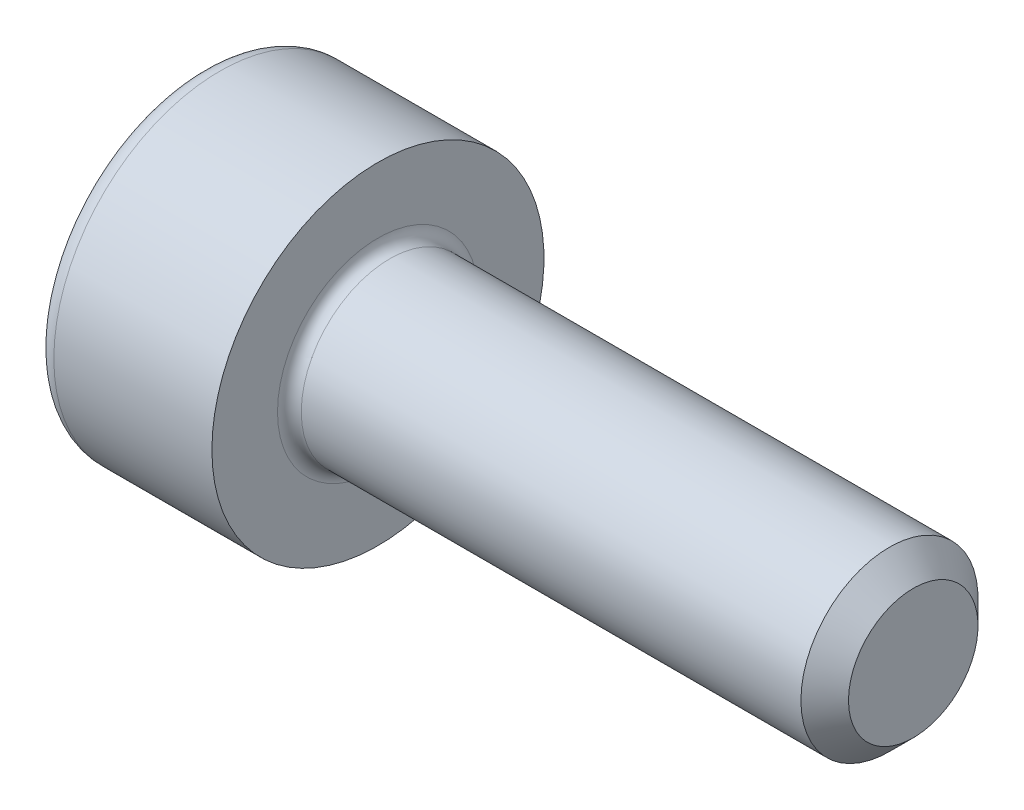
ISO-10303-21;
HEADER;
FILE_DESCRIPTION(('STEP AP214'),'2;1');
FILE_NAME('part.step','',(''),(''),'','','');
FILE_SCHEMA(('AUTOMOTIVE_DESIGN { 1 0 10303 214 1 1 1 1 }'));
ENDSEC;
DATA;
#1=APPLICATION_CONTEXT('core data for automotive mechanical design processes');
#2=APPLICATION_PROTOCOL_DEFINITION('international standard','automotive_design',2000,#1);
#3=PRODUCT_CONTEXT('',#1,'mechanical');
#4=PRODUCT('Part','Part','',(#3));
#5=PRODUCT_RELATED_PRODUCT_CATEGORY('part','',(#4));
#6=PRODUCT_DEFINITION_FORMATION('','',#4);
#7=PRODUCT_DEFINITION_CONTEXT('part definition',#1,'design');
#8=PRODUCT_DEFINITION('design','',#6,#7);
#9=PRODUCT_DEFINITION_SHAPE('','',#8);
#10=(LENGTH_UNIT() NAMED_UNIT(*) SI_UNIT(.MILLI.,.METRE.));
#11=(NAMED_UNIT(*) PLANE_ANGLE_UNIT() SI_UNIT($,.RADIAN.));
#12=(NAMED_UNIT(*) SI_UNIT($,.STERADIAN.) SOLID_ANGLE_UNIT());
#13=UNCERTAINTY_MEASURE_WITH_UNIT(LENGTH_MEASURE(1.E-05),#10,'distance_accuracy_value','');
#14=(GEOMETRIC_REPRESENTATION_CONTEXT(3) GLOBAL_UNCERTAINTY_ASSIGNED_CONTEXT((#13)) GLOBAL_UNIT_ASSIGNED_CONTEXT((#10,
#11,#12)) REPRESENTATION_CONTEXT('',''));
#15=CARTESIAN_POINT('',(0.,0.,0.));
#16=DIRECTION('',(0.,0.,1.));
#17=DIRECTION('',(1.,0.,0.));
#18=AXIS2_PLACEMENT_3D('',#15,#16,#17);
#19=CARTESIAN_POINT('',(0.,0.,0.));
#20=DIRECTION('',(-1.,0.,0.));
#21=DIRECTION('',(0.,0.,1.));
#22=AXIS2_PLACEMENT_3D('',#19,#20,#21);
#23=CYLINDRICAL_SURFACE('',#22,1.39568824458778);
#24=CARTESIAN_POINT('',(0.16,0.,0.));
#25=DIRECTION('',(1.,0.,0.));
#26=DIRECTION('',(0.,0.,-1.));
#27=AXIS2_PLACEMENT_3D('',#24,#25,#26);
#28=CIRCLE('',#27,1.39568824458778);
#29=CARTESIAN_POINT('',(0.16,0.,-1.39568824458778));
#30=VERTEX_POINT('',#29);
#31=EDGE_CURVE('E157',#30,#30,#28,.T.);
#32=ORIENTED_EDGE('',*,*,#31,.T.);
#33=EDGE_LOOP('',(#32));
#34=FACE_BOUND('',#33,.T.);
#35=CARTESIAN_POINT('',(1.48873412756029,0.,0.));
#36=DIRECTION('',(-1.,0.,0.));
#37=DIRECTION('',(0.,0.,1.));
#38=AXIS2_PLACEMENT_3D('',#35,#36,#37);
#39=CIRCLE('',#38,1.39568824458778);
#40=CARTESIAN_POINT('',(1.48873412756029,0.,1.39568824458778));
#41=VERTEX_POINT('',#40);
#42=EDGE_CURVE('E140',#41,#41,#39,.T.);
#43=ORIENTED_EDGE('',*,*,#42,.T.);
#44=EDGE_LOOP('',(#43));
#45=FACE_BOUND('',#44,.T.);
#46=ADVANCED_FACE('F38',(#34,#45),#23,.T.);
#47=CARTESIAN_POINT('',(0.,0.,0.));
#48=DIRECTION('',(1.,0.,0.));
#49=DIRECTION('',(0.,0.,-1.));
#50=AXIS2_PLACEMENT_3D('',#47,#48,#49);
#51=PLANE('',#50);
#52=DIRECTION('',(0.,-0.5,-0.866025403784439));
#53=VECTOR('',#52,1.);
#54=CARTESIAN_POINT('',(0.,0.877572409168232,0.));
#55=LINE('',#54,#53);
#56=CARTESIAN_POINT('',(0.,0.877572409168232,0.));
#57=VERTEX_POINT('',#56);
#58=CARTESIAN_POINT('',(0.,0.438786204584116,-0.760000000000001));
#59=VERTEX_POINT('',#58);
#60=EDGE_CURVE('E127',#57,#59,#55,.T.);
#61=ORIENTED_EDGE('',*,*,#60,.F.);
#62=DIRECTION('',(0.,0.5,-0.866025403784439));
#63=VECTOR('',#62,1.);
#64=CARTESIAN_POINT('',(0.,0.438786204584116,0.76));
#65=LINE('',#64,#63);
#66=CARTESIAN_POINT('',(0.,0.438786204584116,0.76));
#67=VERTEX_POINT('',#66);
#68=EDGE_CURVE('E53',#67,#57,#65,.T.);
#69=ORIENTED_EDGE('',*,*,#68,.F.);
#70=DIRECTION('',(0.,1.,0.));
#71=VECTOR('',#70,1.);
#72=CARTESIAN_POINT('',(0.,-0.438786204584116,0.76));
#73=LINE('',#72,#71);
#74=CARTESIAN_POINT('',(0.,-0.438786204584116,0.76));
#75=VERTEX_POINT('',#74);
#76=EDGE_CURVE('E136',#75,#67,#73,.T.);
#77=ORIENTED_EDGE('',*,*,#76,.F.);
#78=DIRECTION('',(0.,0.5,0.866025403784439));
#79=VECTOR('',#78,1.);
#80=CARTESIAN_POINT('',(0.,-0.877572409168232,0.));
#81=LINE('',#80,#79);
#82=CARTESIAN_POINT('',(0.,-0.877572409168232,0.));
#83=VERTEX_POINT('',#82);
#84=EDGE_CURVE('E134',#83,#75,#81,.T.);
#85=ORIENTED_EDGE('',*,*,#84,.F.);
#86=DIRECTION('',(0.,-0.5,0.866025403784438));
#87=VECTOR('',#86,1.);
#88=CARTESIAN_POINT('',(0.,-0.438786204584116,-0.760000000000001));
#89=LINE('',#88,#87);
#90=CARTESIAN_POINT('',(0.,-0.438786204584116,-0.760000000000001));
#91=VERTEX_POINT('',#90);
#92=EDGE_CURVE('E101',#91,#83,#89,.T.);
#93=ORIENTED_EDGE('',*,*,#92,.F.);
#94=DIRECTION('',(0.,-1.,0.));
#95=VECTOR('',#94,1.);
#96=CARTESIAN_POINT('',(0.,0.438786204584116,-0.760000000000001));
#97=LINE('',#96,#95);
#98=EDGE_CURVE('E130',#59,#91,#97,.T.);
#99=ORIENTED_EDGE('',*,*,#98,.F.);
#100=EDGE_LOOP('',(#61,#69,#77,#85,#93,#99));
#101=FACE_BOUND('',#100,.T.);
#102=CARTESIAN_POINT('',(0.,0.,0.));
#103=DIRECTION('',(1.,0.,0.));
#104=DIRECTION('',(0.,0.,-1.));
#105=AXIS2_PLACEMENT_3D('',#102,#103,#104);
#106=CIRCLE('',#105,1.23568824458778);
#107=CARTESIAN_POINT('',(0.,0.,-1.23568824458778));
#108=VERTEX_POINT('',#107);
#109=EDGE_CURVE('E154',#108,#108,#106,.F.);
#110=ORIENTED_EDGE('',*,*,#109,.T.);
#111=EDGE_LOOP('',(#110));
#112=FACE_BOUND('',#111,.T.);
#113=ADVANCED_FACE('F179',(#101,#112),#51,.F.);
#114=CARTESIAN_POINT('',(5.98873412756029,0.,0.));
#115=DIRECTION('',(-1.,0.,0.));
#116=DIRECTION('',(0.,0.,1.));
#117=AXIS2_PLACEMENT_3D('',#114,#115,#116);
#118=PLANE('',#117);
#119=CARTESIAN_POINT('',(5.98873412756029,0.,0.));
#120=DIRECTION('',(-1.,0.,0.));
#121=DIRECTION('',(0.,0.,1.));
#122=AXIS2_PLACEMENT_3D('',#119,#120,#121);
#123=CIRCLE('',#122,0.544367063780144);
#124=CARTESIAN_POINT('',(5.98873412756029,0.,0.544367063780144));
#125=VERTEX_POINT('',#124);
#126=EDGE_CURVE('E11',#125,#125,#123,.F.);
#127=ORIENTED_EDGE('',*,*,#126,.T.);
#128=EDGE_LOOP('',(#127));
#129=FACE_BOUND('',#128,.T.);
#130=ADVANCED_FACE('F185',(#129),#118,.F.);
#131=CARTESIAN_POINT('',(0.,0.,0.));
#132=DIRECTION('',(-1.,0.,0.));
#133=DIRECTION('',(0.,0.,1.));
#134=AXIS2_PLACEMENT_3D('',#131,#132,#133);
#135=CYLINDRICAL_SURFACE('',#134,0.744367063780146);
#136=CARTESIAN_POINT('',(5.78873412756029,0.,0.));
#137=DIRECTION('',(-1.,0.,0.));
#138=DIRECTION('',(0.,0.,1.));
#139=AXIS2_PLACEMENT_3D('',#136,#137,#138);
#140=CIRCLE('',#139,0.744367063780146);
#141=CARTESIAN_POINT('',(5.78873412756029,0.,0.744367063780146));
#142=VERTEX_POINT('',#141);
#143=EDGE_CURVE('E46',#142,#142,#140,.T.);
#144=ORIENTED_EDGE('',*,*,#143,.T.);
#145=EDGE_LOOP('',(#144));
#146=FACE_BOUND('',#145,.T.);
#147=CARTESIAN_POINT('',(1.58873412756029,0.,0.));
#148=DIRECTION('',(-1.,0.,0.));
#149=DIRECTION('',(0.,0.,1.));
#150=AXIS2_PLACEMENT_3D('',#147,#148,#149);
#151=CIRCLE('',#150,0.744367063780146);
#152=CARTESIAN_POINT('',(1.58873412756029,0.,0.744367063780146));
#153=VERTEX_POINT('',#152);
#154=EDGE_CURVE('E151',#153,#153,#151,.F.);
#155=ORIENTED_EDGE('',*,*,#154,.T.);
#156=EDGE_LOOP('',(#155));
#157=FACE_BOUND('',#156,.T.);
#158=ADVANCED_FACE('F162',(#146,#157),#135,.T.);
#159=CARTESIAN_POINT('',(1.48873412756029,0.,0.));
#160=DIRECTION('',(-1.,0.,0.));
#161=DIRECTION('',(0.,0.,1.));
#162=AXIS2_PLACEMENT_3D('',#159,#160,#161);
#163=PLANE('',#162);
#164=CARTESIAN_POINT('',(1.48873412756029,0.,0.));
#165=DIRECTION('',(-1.,0.,0.));
#166=DIRECTION('',(0.,0.,1.));
#167=AXIS2_PLACEMENT_3D('',#164,#165,#166);
#168=CIRCLE('',#167,0.844367063780146);
#169=CARTESIAN_POINT('',(1.48873412756029,0.,0.844367063780146));
#170=VERTEX_POINT('',#169);
#171=EDGE_CURVE('E148',#170,#170,#168,.T.);
#172=ORIENTED_EDGE('',*,*,#171,.T.);
#173=EDGE_LOOP('',(#172));
#174=FACE_BOUND('',#173,.T.);
#175=ORIENTED_EDGE('',*,*,#42,.F.);
#176=EDGE_LOOP('',(#175));
#177=FACE_BOUND('',#176,.T.);
#178=ADVANCED_FACE('F192',(#174,#177),#163,.F.);
#179=CARTESIAN_POINT('',(1.58873412756029,0.,0.));
#180=DIRECTION('',(-1.,0.,0.));
#181=DIRECTION('',(0.,0.,1.));
#182=AXIS2_PLACEMENT_3D('',#179,#180,#181);
#183=TOROIDAL_SURFACE('',#182,0.844367063780146,0.1);
#184=ORIENTED_EDGE('',*,*,#154,.F.);
#185=EDGE_LOOP('',(#184));
#186=FACE_BOUND('',#185,.T.);
#187=ORIENTED_EDGE('',*,*,#171,.F.);
#188=EDGE_LOOP('',(#187));
#189=FACE_BOUND('',#188,.T.);
#190=ADVANCED_FACE('F175',(#186,#189),#183,.F.);
#191=CARTESIAN_POINT('',(0.16,0.,0.));
#192=DIRECTION('',(1.,0.,0.));
#193=DIRECTION('',(0.,0.,-1.));
#194=AXIS2_PLACEMENT_3D('',#191,#192,#193);
#195=TOROIDAL_SURFACE('',#194,1.23568824458778,0.16);
#196=ORIENTED_EDGE('',*,*,#31,.F.);
#197=EDGE_LOOP('',(#196));
#198=FACE_BOUND('',#197,.T.);
#199=ORIENTED_EDGE('',*,*,#109,.F.);
#200=EDGE_LOOP('',(#199));
#201=FACE_BOUND('',#200,.T.);
#202=ADVANCED_FACE('F167',(#198,#201),#195,.T.);
#203=CARTESIAN_POINT('',(5.78873412756029,0.,0.));
#204=DIRECTION('',(-1.,0.,0.));
#205=DIRECTION('',(0.,0.,1.));
#206=AXIS2_PLACEMENT_3D('',#203,#204,#205);
#207=CONICAL_SURFACE('',#206,0.744367063780146,0.785398163397451);
#208=ORIENTED_EDGE('',*,*,#126,.F.);
#209=EDGE_LOOP('',(#208));
#210=FACE_BOUND('',#209,.T.);
#211=ORIENTED_EDGE('',*,*,#143,.F.);
#212=EDGE_LOOP('',(#211));
#213=FACE_BOUND('',#212,.T.);
#214=ADVANCED_FACE('F40',(#210,#213),#207,.T.);
#215=CARTESIAN_POINT('',(0.7,0.438786204584116,0.76));
#216=DIRECTION('',(0.,0.866025403784439,0.5));
#217=DIRECTION('',(0.,-0.5,0.866025403784439));
#218=AXIS2_PLACEMENT_3D('',#215,#216,#217);
#219=PLANE('',#218);
#220=ORIENTED_EDGE('',*,*,#68,.T.);
#221=DIRECTION('',(-1.,0.,0.));
#222=VECTOR('',#221,1.);
#223=CARTESIAN_POINT('',(0.7,0.877572409168232,0.));
#224=LINE('',#223,#222);
#225=CARTESIAN_POINT('',(0.7,0.877572409168232,0.));
#226=VERTEX_POINT('',#225);
#227=EDGE_CURVE('E83',#226,#57,#224,.T.);
#228=ORIENTED_EDGE('',*,*,#227,.F.);
#229=DIRECTION('',(0.,0.5,-0.866025403784439));
#230=VECTOR('',#229,1.);
#231=CARTESIAN_POINT('',(0.7,0.438786204584116,0.76));
#232=LINE('',#231,#230);
#233=CARTESIAN_POINT('',(0.7,0.438786204584116,0.76));
#234=VERTEX_POINT('',#233);
#235=EDGE_CURVE('E138',#234,#226,#232,.T.);
#236=ORIENTED_EDGE('',*,*,#235,.F.);
#237=DIRECTION('',(-1.,0.,0.));
#238=VECTOR('',#237,1.);
#239=CARTESIAN_POINT('',(0.7,0.438786204584116,0.76));
#240=LINE('',#239,#238);
#241=EDGE_CURVE('E61',#234,#67,#240,.T.);
#242=ORIENTED_EDGE('',*,*,#241,.T.);
#243=EDGE_LOOP('',(#220,#228,#236,#242));
#244=FACE_BOUND('',#243,.T.);
#245=ADVANCED_FACE('F166',(#244),#219,.F.);
#246=CARTESIAN_POINT('',(0.7,-0.438786204584116,0.76));
#247=DIRECTION('',(0.,0.,1.));
#248=DIRECTION('',(1.,0.,0.));
#249=AXIS2_PLACEMENT_3D('',#246,#247,#248);
#250=PLANE('',#249);
#251=ORIENTED_EDGE('',*,*,#76,.T.);
#252=ORIENTED_EDGE('',*,*,#241,.F.);
#253=DIRECTION('',(0.,1.,0.));
#254=VECTOR('',#253,1.);
#255=CARTESIAN_POINT('',(0.7,-0.438786204584116,0.76));
#256=LINE('',#255,#254);
#257=CARTESIAN_POINT('',(0.7,-0.438786204584116,0.76));
#258=VERTEX_POINT('',#257);
#259=EDGE_CURVE('E113',#258,#234,#256,.T.);
#260=ORIENTED_EDGE('',*,*,#259,.F.);
#261=DIRECTION('',(-1.,0.,0.));
#262=VECTOR('',#261,1.);
#263=CARTESIAN_POINT('',(0.7,-0.438786204584116,0.76));
#264=LINE('',#263,#262);
#265=EDGE_CURVE('E105',#258,#75,#264,.T.);
#266=ORIENTED_EDGE('',*,*,#265,.T.);
#267=EDGE_LOOP('',(#251,#252,#260,#266));
#268=FACE_BOUND('',#267,.T.);
#269=ADVANCED_FACE('F173',(#268),#250,.F.);
#270=CARTESIAN_POINT('',(0.7,-0.877572409168232,0.));
#271=DIRECTION('',(0.,-0.866025403784439,0.5));
#272=DIRECTION('',(0.,-0.5,-0.866025403784439));
#273=AXIS2_PLACEMENT_3D('',#270,#271,#272);
#274=PLANE('',#273);
#275=ORIENTED_EDGE('',*,*,#84,.T.);
#276=ORIENTED_EDGE('',*,*,#265,.F.);
#277=DIRECTION('',(0.,0.5,0.866025403784439));
#278=VECTOR('',#277,1.);
#279=CARTESIAN_POINT('',(0.7,-0.877572409168232,0.));
#280=LINE('',#279,#278);
#281=CARTESIAN_POINT('',(0.7,-0.877572409168232,0.));
#282=VERTEX_POINT('',#281);
#283=EDGE_CURVE('E109',#282,#258,#280,.T.);
#284=ORIENTED_EDGE('',*,*,#283,.F.);
#285=DIRECTION('',(-1.,0.,0.));
#286=VECTOR('',#285,1.);
#287=CARTESIAN_POINT('',(0.7,-0.877572409168232,0.));
#288=LINE('',#287,#286);
#289=EDGE_CURVE('E94',#282,#83,#288,.T.);
#290=ORIENTED_EDGE('',*,*,#289,.T.);
#291=EDGE_LOOP('',(#275,#276,#284,#290));
#292=FACE_BOUND('',#291,.T.);
#293=ADVANCED_FACE('F110',(#292),#274,.F.);
#294=CARTESIAN_POINT('',(0.7,-0.438786204584116,-0.760000000000001));
#295=DIRECTION('',(0.,-0.866025403784438,-0.5));
#296=DIRECTION('',(0.,0.5,-0.866025403784438));
#297=AXIS2_PLACEMENT_3D('',#294,#295,#296);
#298=PLANE('',#297);
#299=ORIENTED_EDGE('',*,*,#92,.T.);
#300=ORIENTED_EDGE('',*,*,#289,.F.);
#301=DIRECTION('',(0.,-0.5,0.866025403784438));
#302=VECTOR('',#301,1.);
#303=CARTESIAN_POINT('',(0.7,-0.438786204584116,-0.760000000000001));
#304=LINE('',#303,#302);
#305=CARTESIAN_POINT('',(0.7,-0.438786204584116,-0.760000000000001));
#306=VERTEX_POINT('',#305);
#307=EDGE_CURVE('E98',#306,#282,#304,.T.);
#308=ORIENTED_EDGE('',*,*,#307,.F.);
#309=DIRECTION('',(-1.,0.,0.));
#310=VECTOR('',#309,1.);
#311=CARTESIAN_POINT('',(0.7,-0.438786204584116,-0.760000000000001));
#312=LINE('',#311,#310);
#313=EDGE_CURVE('E106',#306,#91,#312,.T.);
#314=ORIENTED_EDGE('',*,*,#313,.T.);
#315=EDGE_LOOP('',(#299,#300,#308,#314));
#316=FACE_BOUND('',#315,.T.);
#317=ADVANCED_FACE('F96',(#316),#298,.F.);
#318=CARTESIAN_POINT('',(0.7,0.438786204584116,-0.760000000000001));
#319=DIRECTION('',(0.,0.,-1.));
#320=DIRECTION('',(0.,1.,0.));
#321=AXIS2_PLACEMENT_3D('',#318,#319,#320);
#322=PLANE('',#321);
#323=ORIENTED_EDGE('',*,*,#98,.T.);
#324=ORIENTED_EDGE('',*,*,#313,.F.);
#325=DIRECTION('',(0.,-1.,0.));
#326=VECTOR('',#325,1.);
#327=CARTESIAN_POINT('',(0.7,0.438786204584116,-0.760000000000001));
#328=LINE('',#327,#326);
#329=CARTESIAN_POINT('',(0.7,0.438786204584116,-0.760000000000001));
#330=VERTEX_POINT('',#329);
#331=EDGE_CURVE('E119',#330,#306,#328,.T.);
#332=ORIENTED_EDGE('',*,*,#331,.F.);
#333=DIRECTION('',(-1.,0.,0.));
#334=VECTOR('',#333,1.);
#335=CARTESIAN_POINT('',(0.7,0.438786204584116,-0.760000000000001));
#336=LINE('',#335,#334);
#337=EDGE_CURVE('E143',#330,#59,#336,.T.);
#338=ORIENTED_EDGE('',*,*,#337,.T.);
#339=EDGE_LOOP('',(#323,#324,#332,#338));
#340=FACE_BOUND('',#339,.T.);
#341=ADVANCED_FACE('F214',(#340),#322,.F.);
#342=CARTESIAN_POINT('',(0.7,0.877572409168232,0.));
#343=DIRECTION('',(0.,0.866025403784439,-0.5));
#344=DIRECTION('',(0.,0.5,0.866025403784439));
#345=AXIS2_PLACEMENT_3D('',#342,#343,#344);
#346=PLANE('',#345);
#347=ORIENTED_EDGE('',*,*,#60,.T.);
#348=ORIENTED_EDGE('',*,*,#337,.F.);
#349=DIRECTION('',(0.,-0.5,-0.866025403784439));
#350=VECTOR('',#349,1.);
#351=CARTESIAN_POINT('',(0.7,0.877572409168232,0.));
#352=LINE('',#351,#350);
#353=EDGE_CURVE('E121',#226,#330,#352,.T.);
#354=ORIENTED_EDGE('',*,*,#353,.F.);
#355=ORIENTED_EDGE('',*,*,#227,.T.);
#356=EDGE_LOOP('',(#347,#348,#354,#355));
#357=FACE_BOUND('',#356,.T.);
#358=ADVANCED_FACE('F211',(#357),#346,.F.);
#359=CARTESIAN_POINT('',(0.7,0.,0.));
#360=DIRECTION('',(-1.,0.,0.));
#361=DIRECTION('',(0.,0.,1.));
#362=AXIS2_PLACEMENT_3D('',#359,#360,#361);
#363=PLANE('',#362);
#364=ORIENTED_EDGE('',*,*,#235,.T.);
#365=ORIENTED_EDGE('',*,*,#353,.T.);
#366=ORIENTED_EDGE('',*,*,#331,.T.);
#367=ORIENTED_EDGE('',*,*,#307,.T.);
#368=ORIENTED_EDGE('',*,*,#283,.T.);
#369=ORIENTED_EDGE('',*,*,#259,.T.);
#370=EDGE_LOOP('',(#364,#365,#366,#367,#368,#369));
#371=FACE_BOUND('',#370,.T.);
#372=ADVANCED_FACE('F116',(#371),#363,.T.);
#373=CLOSED_SHELL('',(#46,#113,#130,#158,#178,#190,#202,#214,#245,#269,#293,#317,#341,#358,#372));
#374=MANIFOLD_SOLID_BREP('B2',#373);
#375=ADVANCED_BREP_SHAPE_REPRESENTATION('',(#18,#374),#14);
#376=SHAPE_DEFINITION_REPRESENTATION(#9,#375);
ENDSEC;
END-ISO-10303-21;
